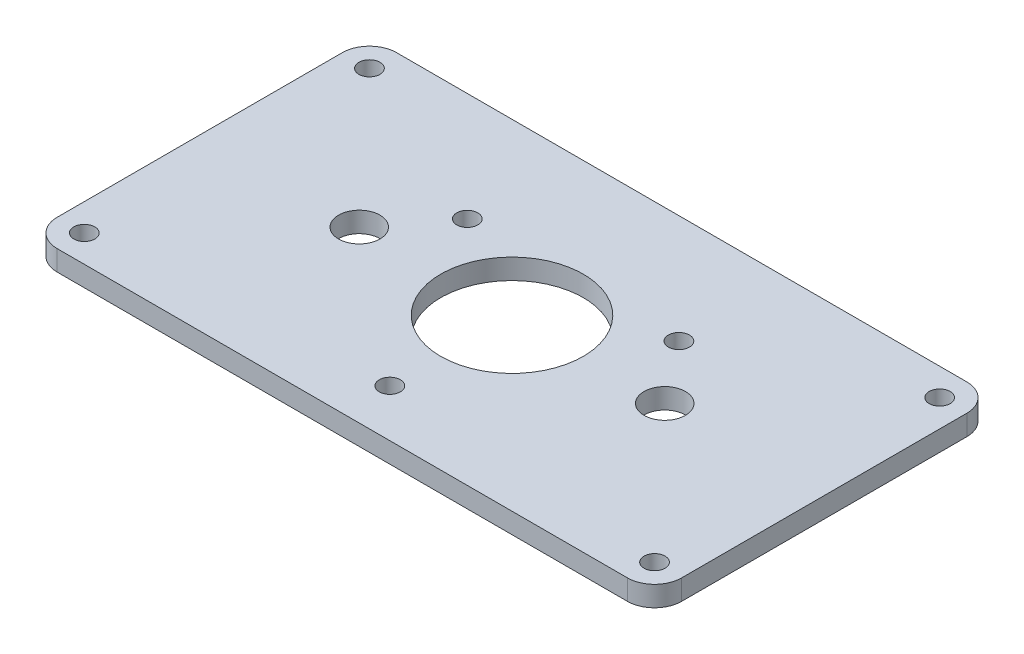
ISO-10303-21;
HEADER;
FILE_DESCRIPTION(('STEP AP214'),'2;1');
FILE_NAME('part.step','',(''),(''),'','','');
FILE_SCHEMA(('AUTOMOTIVE_DESIGN { 1 0 10303 214 1 1 1 1 }'));
ENDSEC;
DATA;
#1=APPLICATION_CONTEXT('core data for automotive mechanical design processes');
#2=APPLICATION_PROTOCOL_DEFINITION('international standard','automotive_design',2000,#1);
#3=PRODUCT_CONTEXT('',#1,'mechanical');
#4=PRODUCT('Part','Part','',(#3));
#5=PRODUCT_RELATED_PRODUCT_CATEGORY('part','',(#4));
#6=PRODUCT_DEFINITION_FORMATION('','',#4);
#7=PRODUCT_DEFINITION_CONTEXT('part definition',#1,'design');
#8=PRODUCT_DEFINITION('design','',#6,#7);
#9=PRODUCT_DEFINITION_SHAPE('','',#8);
#10=(LENGTH_UNIT() NAMED_UNIT(*) SI_UNIT(.MILLI.,.METRE.));
#11=(NAMED_UNIT(*) PLANE_ANGLE_UNIT() SI_UNIT($,.RADIAN.));
#12=(NAMED_UNIT(*) SI_UNIT($,.STERADIAN.) SOLID_ANGLE_UNIT());
#13=UNCERTAINTY_MEASURE_WITH_UNIT(LENGTH_MEASURE(1.E-05),#10,'distance_accuracy_value','');
#14=(GEOMETRIC_REPRESENTATION_CONTEXT(3) GLOBAL_UNCERTAINTY_ASSIGNED_CONTEXT((#13)) GLOBAL_UNIT_ASSIGNED_CONTEXT((#10,
#11,#12)) REPRESENTATION_CONTEXT('',''));
#15=CARTESIAN_POINT('',(0.,0.,0.));
#16=DIRECTION('',(0.,0.,1.));
#17=DIRECTION('',(1.,0.,0.));
#18=AXIS2_PLACEMENT_3D('',#15,#16,#17);
#19=CARTESIAN_POINT('',(0.,3.,0.));
#20=DIRECTION('',(0.,-1.,0.));
#21=DIRECTION('',(0.,0.,-1.));
#22=AXIS2_PLACEMENT_3D('',#19,#20,#21);
#23=PLANE('',#22);
#24=CARTESIAN_POINT('',(-22.5,3.,0.));
#25=DIRECTION('',(0.,-1.,0.));
#26=DIRECTION('',(0.,0.,-1.));
#27=AXIS2_PLACEMENT_3D('',#24,#25,#26);
#28=CIRCLE('',#27,3.05);
#29=CARTESIAN_POINT('',(-22.5,3.,-3.05));
#30=VERTEX_POINT('',#29);
#31=EDGE_CURVE('E222',#30,#30,#28,.T.);
#32=ORIENTED_EDGE('',*,*,#31,.T.);
#33=EDGE_LOOP('',(#32));
#34=FACE_BOUND('',#33,.T.);
#35=CARTESIAN_POINT('',(22.5,3.,0.));
#36=DIRECTION('',(0.,-1.,0.));
#37=DIRECTION('',(0.,0.,-1.));
#38=AXIS2_PLACEMENT_3D('',#35,#36,#37);
#39=CIRCLE('',#38,3.05);
#40=CARTESIAN_POINT('',(22.5,3.,-3.04999999999999));
#41=VERTEX_POINT('',#40);
#42=EDGE_CURVE('E227',#41,#41,#39,.T.);
#43=ORIENTED_EDGE('',*,*,#42,.T.);
#44=EDGE_LOOP('',(#43));
#45=FACE_BOUND('',#44,.T.);
#46=DIRECTION('',(0.,0.,-1.));
#47=VECTOR('',#46,1.);
#48=CARTESIAN_POINT('',(46.,3.,25.));
#49=LINE('',#48,#47);
#50=CARTESIAN_POINT('',(46.,3.,21.));
#51=VERTEX_POINT('',#50);
#52=CARTESIAN_POINT('',(46.,3.,-21.));
#53=VERTEX_POINT('',#52);
#54=EDGE_CURVE('E137',#51,#53,#49,.T.);
#55=ORIENTED_EDGE('',*,*,#54,.T.);
#56=CARTESIAN_POINT('',(42.,3.,-21.));
#57=DIRECTION('',(0.,-1.,0.));
#58=DIRECTION('',(0.,0.,-1.));
#59=AXIS2_PLACEMENT_3D('',#56,#57,#58);
#60=CIRCLE('',#59,4.);
#61=CARTESIAN_POINT('',(42.,3.,-25.));
#62=VERTEX_POINT('',#61);
#63=EDGE_CURVE('E152',#53,#62,#60,.F.);
#64=ORIENTED_EDGE('',*,*,#63,.T.);
#65=DIRECTION('',(-1.,0.,0.));
#66=VECTOR('',#65,1.);
#67=CARTESIAN_POINT('',(-46.,3.,-25.));
#68=LINE('',#67,#66);
#69=CARTESIAN_POINT('',(-42.,3.,-25.));
#70=VERTEX_POINT('',#69);
#71=EDGE_CURVE('E119',#62,#70,#68,.T.);
#72=ORIENTED_EDGE('',*,*,#71,.T.);
#73=CARTESIAN_POINT('',(-42.,3.,-21.));
#74=DIRECTION('',(0.,-1.,0.));
#75=DIRECTION('',(0.,0.,-1.));
#76=AXIS2_PLACEMENT_3D('',#73,#74,#75);
#77=CIRCLE('',#76,4.);
#78=CARTESIAN_POINT('',(-46.,3.,-21.));
#79=VERTEX_POINT('',#78);
#80=EDGE_CURVE('E147',#70,#79,#77,.F.);
#81=ORIENTED_EDGE('',*,*,#80,.T.);
#82=DIRECTION('',(0.,0.,1.));
#83=VECTOR('',#82,1.);
#84=CARTESIAN_POINT('',(-46.,3.,25.));
#85=LINE('',#84,#83);
#86=CARTESIAN_POINT('',(-46.,3.,21.));
#87=VERTEX_POINT('',#86);
#88=EDGE_CURVE('E163',#79,#87,#85,.T.);
#89=ORIENTED_EDGE('',*,*,#88,.T.);
#90=CARTESIAN_POINT('',(-42.,3.,21.));
#91=DIRECTION('',(0.,-1.,0.));
#92=DIRECTION('',(0.,0.,-1.));
#93=AXIS2_PLACEMENT_3D('',#90,#91,#92);
#94=CIRCLE('',#93,4.);
#95=CARTESIAN_POINT('',(-42.,3.,25.));
#96=VERTEX_POINT('',#95);
#97=EDGE_CURVE('E55',#87,#96,#94,.F.);
#98=ORIENTED_EDGE('',*,*,#97,.T.);
#99=DIRECTION('',(1.,0.,0.));
#100=VECTOR('',#99,1.);
#101=CARTESIAN_POINT('',(-46.,3.,25.));
#102=LINE('',#101,#100);
#103=CARTESIAN_POINT('',(42.,3.,25.));
#104=VERTEX_POINT('',#103);
#105=EDGE_CURVE('E138',#96,#104,#102,.T.);
#106=ORIENTED_EDGE('',*,*,#105,.T.);
#107=CARTESIAN_POINT('',(42.,3.,21.));
#108=DIRECTION('',(0.,-1.,0.));
#109=DIRECTION('',(0.,0.,-1.));
#110=AXIS2_PLACEMENT_3D('',#107,#108,#109);
#111=CIRCLE('',#110,4.);
#112=EDGE_CURVE('E150',#104,#51,#111,.F.);
#113=ORIENTED_EDGE('',*,*,#112,.T.);
#114=EDGE_LOOP('',(#55,#64,#72,#81,#89,#98,#106,#113));
#115=FACE_BOUND('',#114,.T.);
#116=CARTESIAN_POINT('',(0.,3.,0.));
#117=DIRECTION('',(0.,1.,0.));
#118=DIRECTION('',(0.,0.,1.));
#119=AXIS2_PLACEMENT_3D('',#116,#117,#118);
#120=CIRCLE('',#119,10.5);
#121=CARTESIAN_POINT('',(0.,3.,10.5));
#122=VERTEX_POINT('',#121);
#123=EDGE_CURVE('E132',#122,#122,#120,.T.);
#124=ORIENTED_EDGE('',*,*,#123,.F.);
#125=EDGE_LOOP('',(#124));
#126=FACE_BOUND('',#125,.T.);
#127=CARTESIAN_POINT('',(42.,3.,-21.));
#128=DIRECTION('',(0.,1.,0.));
#129=DIRECTION('',(0.,0.,1.));
#130=AXIS2_PLACEMENT_3D('',#127,#128,#129);
#131=CIRCLE('',#130,1.55);
#132=CARTESIAN_POINT('',(42.,3.,-19.45));
#133=VERTEX_POINT('',#132);
#134=EDGE_CURVE('E180',#133,#133,#131,.T.);
#135=ORIENTED_EDGE('',*,*,#134,.F.);
#136=EDGE_LOOP('',(#135));
#137=FACE_BOUND('',#136,.T.);
#138=CARTESIAN_POINT('',(-42.,3.,-21.));
#139=DIRECTION('',(0.,1.,0.));
#140=DIRECTION('',(0.,0.,-1.));
#141=AXIS2_PLACEMENT_3D('',#138,#139,#140);
#142=CIRCLE('',#141,1.55);
#143=CARTESIAN_POINT('',(-42.,3.,-22.55));
#144=VERTEX_POINT('',#143);
#145=EDGE_CURVE('E186',#144,#144,#142,.T.);
#146=ORIENTED_EDGE('',*,*,#145,.F.);
#147=EDGE_LOOP('',(#146));
#148=FACE_BOUND('',#147,.T.);
#149=CARTESIAN_POINT('',(42.,3.,21.));
#150=DIRECTION('',(0.,1.,0.));
#151=DIRECTION('',(0.,0.,-1.));
#152=AXIS2_PLACEMENT_3D('',#149,#150,#151);
#153=CIRCLE('',#152,1.55);
#154=CARTESIAN_POINT('',(42.,3.,19.45));
#155=VERTEX_POINT('',#154);
#156=EDGE_CURVE('E192',#155,#155,#153,.T.);
#157=ORIENTED_EDGE('',*,*,#156,.F.);
#158=EDGE_LOOP('',(#157));
#159=FACE_BOUND('',#158,.T.);
#160=CARTESIAN_POINT('',(-42.,3.,21.));
#161=DIRECTION('',(0.,1.,0.));
#162=DIRECTION('',(0.,0.,1.));
#163=AXIS2_PLACEMENT_3D('',#160,#161,#162);
#164=CIRCLE('',#163,1.55);
#165=CARTESIAN_POINT('',(-42.,3.,22.55));
#166=VERTEX_POINT('',#165);
#167=EDGE_CURVE('E198',#166,#166,#164,.T.);
#168=ORIENTED_EDGE('',*,*,#167,.F.);
#169=EDGE_LOOP('',(#168));
#170=FACE_BOUND('',#169,.T.);
#171=CARTESIAN_POINT('',(0.,3.,18.));
#172=DIRECTION('',(0.,1.,0.));
#173=DIRECTION('',(0.,0.,1.));
#174=AXIS2_PLACEMENT_3D('',#171,#172,#173);
#175=CIRCLE('',#174,1.55);
#176=CARTESIAN_POINT('',(0.,3.,19.55));
#177=VERTEX_POINT('',#176);
#178=EDGE_CURVE('E204',#177,#177,#175,.T.);
#179=ORIENTED_EDGE('',*,*,#178,.F.);
#180=EDGE_LOOP('',(#179));
#181=FACE_BOUND('',#180,.T.);
#182=CARTESIAN_POINT('',(-15.5884572681199,3.,-8.99999999999999));
#183=DIRECTION('',(0.,1.,0.));
#184=DIRECTION('',(0.,0.,1.));
#185=AXIS2_PLACEMENT_3D('',#182,#183,#184);
#186=CIRCLE('',#185,1.55);
#187=CARTESIAN_POINT('',(-15.5884572681199,3.,-7.44999999999999));
#188=VERTEX_POINT('',#187);
#189=EDGE_CURVE('E210',#188,#188,#186,.T.);
#190=ORIENTED_EDGE('',*,*,#189,.F.);
#191=EDGE_LOOP('',(#190));
#192=FACE_BOUND('',#191,.T.);
#193=CARTESIAN_POINT('',(15.5884572681199,3.,-9.00000000000001));
#194=DIRECTION('',(0.,1.,0.));
#195=DIRECTION('',(0.,0.,1.));
#196=AXIS2_PLACEMENT_3D('',#193,#194,#195);
#197=CIRCLE('',#196,1.55);
#198=CARTESIAN_POINT('',(15.5884572681199,3.,-7.45000000000002));
#199=VERTEX_POINT('',#198);
#200=EDGE_CURVE('E216',#199,#199,#197,.T.);
#201=ORIENTED_EDGE('',*,*,#200,.F.);
#202=EDGE_LOOP('',(#201));
#203=FACE_BOUND('',#202,.T.);
#204=ADVANCED_FACE('F33',(#34,#45,#115,#126,#137,#148,#159,#170,#181,#192,#203),#23,.F.);
#205=CARTESIAN_POINT('',(0.,0.,0.));
#206=DIRECTION('',(0.,-1.,0.));
#207=DIRECTION('',(0.,0.,-1.));
#208=AXIS2_PLACEMENT_3D('',#205,#206,#207);
#209=PLANE('',#208);
#210=CARTESIAN_POINT('',(-22.5,0.,0.));
#211=DIRECTION('',(0.,-1.,0.));
#212=DIRECTION('',(0.,0.,-1.));
#213=AXIS2_PLACEMENT_3D('',#210,#211,#212);
#214=CIRCLE('',#213,3.05);
#215=CARTESIAN_POINT('',(-22.5,0.,-3.05));
#216=VERTEX_POINT('',#215);
#217=EDGE_CURVE('E230',#216,#216,#214,.T.);
#218=ORIENTED_EDGE('',*,*,#217,.F.);
#219=EDGE_LOOP('',(#218));
#220=FACE_BOUND('',#219,.T.);
#221=CARTESIAN_POINT('',(22.5,0.,0.));
#222=DIRECTION('',(0.,-1.,0.));
#223=DIRECTION('',(0.,0.,-1.));
#224=AXIS2_PLACEMENT_3D('',#221,#222,#223);
#225=CIRCLE('',#224,3.05);
#226=CARTESIAN_POINT('',(22.5,0.,-3.04999999999999));
#227=VERTEX_POINT('',#226);
#228=EDGE_CURVE('E231',#227,#227,#225,.T.);
#229=ORIENTED_EDGE('',*,*,#228,.F.);
#230=EDGE_LOOP('',(#229));
#231=FACE_BOUND('',#230,.T.);
#232=CARTESIAN_POINT('',(-15.5884572681199,0.,-8.99999999999999));
#233=DIRECTION('',(0.,1.,0.));
#234=DIRECTION('',(0.,0.,1.));
#235=AXIS2_PLACEMENT_3D('',#232,#233,#234);
#236=CIRCLE('',#235,1.55);
#237=CARTESIAN_POINT('',(-15.5884572681199,0.,-7.44999999999999));
#238=VERTEX_POINT('',#237);
#239=EDGE_CURVE('E213',#238,#238,#236,.T.);
#240=ORIENTED_EDGE('',*,*,#239,.T.);
#241=EDGE_LOOP('',(#240));
#242=FACE_BOUND('',#241,.T.);
#243=CARTESIAN_POINT('',(-42.,0.,21.));
#244=DIRECTION('',(0.,1.,0.));
#245=DIRECTION('',(0.,0.,1.));
#246=AXIS2_PLACEMENT_3D('',#243,#244,#245);
#247=CIRCLE('',#246,1.55);
#248=CARTESIAN_POINT('',(-42.,0.,22.55));
#249=VERTEX_POINT('',#248);
#250=EDGE_CURVE('E201',#249,#249,#247,.T.);
#251=ORIENTED_EDGE('',*,*,#250,.T.);
#252=EDGE_LOOP('',(#251));
#253=FACE_BOUND('',#252,.T.);
#254=CARTESIAN_POINT('',(-42.,0.,-21.));
#255=DIRECTION('',(0.,1.,0.));
#256=DIRECTION('',(0.,0.,-1.));
#257=AXIS2_PLACEMENT_3D('',#254,#255,#256);
#258=CIRCLE('',#257,1.55);
#259=CARTESIAN_POINT('',(-42.,0.,-22.55));
#260=VERTEX_POINT('',#259);
#261=EDGE_CURVE('E189',#260,#260,#258,.T.);
#262=ORIENTED_EDGE('',*,*,#261,.T.);
#263=EDGE_LOOP('',(#262));
#264=FACE_BOUND('',#263,.T.);
#265=CARTESIAN_POINT('',(0.,0.,0.));
#266=DIRECTION('',(0.,1.,0.));
#267=DIRECTION('',(0.,0.,1.));
#268=AXIS2_PLACEMENT_3D('',#265,#266,#267);
#269=CIRCLE('',#268,10.5);
#270=CARTESIAN_POINT('',(0.,0.,10.5));
#271=VERTEX_POINT('',#270);
#272=EDGE_CURVE('E177',#271,#271,#269,.T.);
#273=ORIENTED_EDGE('',*,*,#272,.T.);
#274=EDGE_LOOP('',(#273));
#275=FACE_BOUND('',#274,.T.);
#276=DIRECTION('',(-1.,0.,0.));
#277=VECTOR('',#276,1.);
#278=CARTESIAN_POINT('',(-46.,0.,-25.));
#279=LINE('',#278,#277);
#280=CARTESIAN_POINT('',(42.,0.,-25.));
#281=VERTEX_POINT('',#280);
#282=CARTESIAN_POINT('',(-42.,0.,-25.));
#283=VERTEX_POINT('',#282);
#284=EDGE_CURVE('E116',#281,#283,#279,.T.);
#285=ORIENTED_EDGE('',*,*,#284,.F.);
#286=CARTESIAN_POINT('',(42.,0.,-21.));
#287=DIRECTION('',(0.,-1.,0.));
#288=DIRECTION('',(0.,0.,-1.));
#289=AXIS2_PLACEMENT_3D('',#286,#287,#288);
#290=CIRCLE('',#289,4.);
#291=CARTESIAN_POINT('',(46.,0.,-21.));
#292=VERTEX_POINT('',#291);
#293=EDGE_CURVE('E99',#281,#292,#290,.T.);
#294=ORIENTED_EDGE('',*,*,#293,.T.);
#295=DIRECTION('',(0.,0.,-1.));
#296=VECTOR('',#295,1.);
#297=CARTESIAN_POINT('',(46.,0.,25.));
#298=LINE('',#297,#296);
#299=CARTESIAN_POINT('',(46.,0.,21.));
#300=VERTEX_POINT('',#299);
#301=EDGE_CURVE('E127',#300,#292,#298,.T.);
#302=ORIENTED_EDGE('',*,*,#301,.F.);
#303=CARTESIAN_POINT('',(42.,0.,21.));
#304=DIRECTION('',(0.,-1.,0.));
#305=DIRECTION('',(0.,0.,-1.));
#306=AXIS2_PLACEMENT_3D('',#303,#304,#305);
#307=CIRCLE('',#306,4.);
#308=CARTESIAN_POINT('',(42.,0.,25.));
#309=VERTEX_POINT('',#308);
#310=EDGE_CURVE('E110',#300,#309,#307,.T.);
#311=ORIENTED_EDGE('',*,*,#310,.T.);
#312=DIRECTION('',(1.,0.,0.));
#313=VECTOR('',#312,1.);
#314=CARTESIAN_POINT('',(-46.,0.,25.));
#315=LINE('',#314,#313);
#316=CARTESIAN_POINT('',(-42.,0.,25.));
#317=VERTEX_POINT('',#316);
#318=EDGE_CURVE('E130',#317,#309,#315,.T.);
#319=ORIENTED_EDGE('',*,*,#318,.F.);
#320=CARTESIAN_POINT('',(-42.,0.,21.));
#321=DIRECTION('',(0.,-1.,0.));
#322=DIRECTION('',(0.,0.,-1.));
#323=AXIS2_PLACEMENT_3D('',#320,#321,#322);
#324=CIRCLE('',#323,4.);
#325=CARTESIAN_POINT('',(-46.,0.,21.));
#326=VERTEX_POINT('',#325);
#327=EDGE_CURVE('E141',#317,#326,#324,.T.);
#328=ORIENTED_EDGE('',*,*,#327,.T.);
#329=DIRECTION('',(0.,0.,1.));
#330=VECTOR('',#329,1.);
#331=CARTESIAN_POINT('',(-46.,0.,25.));
#332=LINE('',#331,#330);
#333=CARTESIAN_POINT('',(-46.,0.,-21.));
#334=VERTEX_POINT('',#333);
#335=EDGE_CURVE('E126',#334,#326,#332,.T.);
#336=ORIENTED_EDGE('',*,*,#335,.F.);
#337=CARTESIAN_POINT('',(-42.,0.,-21.));
#338=DIRECTION('',(0.,-1.,0.));
#339=DIRECTION('',(0.,0.,-1.));
#340=AXIS2_PLACEMENT_3D('',#337,#338,#339);
#341=CIRCLE('',#340,4.);
#342=EDGE_CURVE('E120',#334,#283,#341,.T.);
#343=ORIENTED_EDGE('',*,*,#342,.T.);
#344=EDGE_LOOP('',(#285,#294,#302,#311,#319,#328,#336,#343));
#345=FACE_BOUND('',#344,.T.);
#346=CARTESIAN_POINT('',(42.,0.,-21.));
#347=DIRECTION('',(0.,1.,0.));
#348=DIRECTION('',(0.,0.,1.));
#349=AXIS2_PLACEMENT_3D('',#346,#347,#348);
#350=CIRCLE('',#349,1.55);
#351=CARTESIAN_POINT('',(42.,0.,-19.45));
#352=VERTEX_POINT('',#351);
#353=EDGE_CURVE('E183',#352,#352,#350,.T.);
#354=ORIENTED_EDGE('',*,*,#353,.T.);
#355=EDGE_LOOP('',(#354));
#356=FACE_BOUND('',#355,.T.);
#357=CARTESIAN_POINT('',(42.,0.,21.));
#358=DIRECTION('',(0.,1.,0.));
#359=DIRECTION('',(0.,0.,-1.));
#360=AXIS2_PLACEMENT_3D('',#357,#358,#359);
#361=CIRCLE('',#360,1.55);
#362=CARTESIAN_POINT('',(42.,0.,19.45));
#363=VERTEX_POINT('',#362);
#364=EDGE_CURVE('E195',#363,#363,#361,.T.);
#365=ORIENTED_EDGE('',*,*,#364,.T.);
#366=EDGE_LOOP('',(#365));
#367=FACE_BOUND('',#366,.T.);
#368=CARTESIAN_POINT('',(0.,0.,18.));
#369=DIRECTION('',(0.,1.,0.));
#370=DIRECTION('',(0.,0.,1.));
#371=AXIS2_PLACEMENT_3D('',#368,#369,#370);
#372=CIRCLE('',#371,1.55);
#373=CARTESIAN_POINT('',(0.,0.,19.55));
#374=VERTEX_POINT('',#373);
#375=EDGE_CURVE('E207',#374,#374,#372,.T.);
#376=ORIENTED_EDGE('',*,*,#375,.T.);
#377=EDGE_LOOP('',(#376));
#378=FACE_BOUND('',#377,.T.);
#379=CARTESIAN_POINT('',(15.5884572681199,0.,-9.00000000000001));
#380=DIRECTION('',(0.,1.,0.));
#381=DIRECTION('',(0.,0.,1.));
#382=AXIS2_PLACEMENT_3D('',#379,#380,#381);
#383=CIRCLE('',#382,1.55);
#384=CARTESIAN_POINT('',(15.5884572681199,0.,-7.45000000000002));
#385=VERTEX_POINT('',#384);
#386=EDGE_CURVE('E219',#385,#385,#383,.T.);
#387=ORIENTED_EDGE('',*,*,#386,.T.);
#388=EDGE_LOOP('',(#387));
#389=FACE_BOUND('',#388,.T.);
#390=ADVANCED_FACE('F123',(#220,#231,#242,#253,#264,#275,#345,#356,#367,#378,#389),#209,.T.);
#391=CARTESIAN_POINT('',(46.,3.,25.));
#392=DIRECTION('',(-1.,0.,0.));
#393=DIRECTION('',(0.,0.,1.));
#394=AXIS2_PLACEMENT_3D('',#391,#392,#393);
#395=PLANE('',#394);
#396=ORIENTED_EDGE('',*,*,#301,.T.);
#397=DIRECTION('',(0.,-1.,0.));
#398=VECTOR('',#397,1.);
#399=CARTESIAN_POINT('',(46.,3.,-21.));
#400=LINE('',#399,#398);
#401=EDGE_CURVE('E104',#292,#53,#400,.F.);
#402=ORIENTED_EDGE('',*,*,#401,.T.);
#403=ORIENTED_EDGE('',*,*,#54,.F.);
#404=DIRECTION('',(0.,-1.,0.));
#405=VECTOR('',#404,1.);
#406=CARTESIAN_POINT('',(46.,3.,21.));
#407=LINE('',#406,#405);
#408=EDGE_CURVE('E109',#51,#300,#407,.T.);
#409=ORIENTED_EDGE('',*,*,#408,.T.);
#410=EDGE_LOOP('',(#396,#402,#403,#409));
#411=FACE_BOUND('',#410,.T.);
#412=ADVANCED_FACE('F242',(#411),#395,.F.);
#413=CARTESIAN_POINT('',(-46.,3.,-25.));
#414=DIRECTION('',(0.,0.,1.));
#415=DIRECTION('',(1.,0.,0.));
#416=AXIS2_PLACEMENT_3D('',#413,#414,#415);
#417=PLANE('',#416);
#418=ORIENTED_EDGE('',*,*,#71,.F.);
#419=DIRECTION('',(0.,-1.,0.));
#420=VECTOR('',#419,1.);
#421=CARTESIAN_POINT('',(42.,3.,-25.));
#422=LINE('',#421,#420);
#423=EDGE_CURVE('E103',#62,#281,#422,.T.);
#424=ORIENTED_EDGE('',*,*,#423,.T.);
#425=ORIENTED_EDGE('',*,*,#284,.T.);
#426=DIRECTION('',(0.,-1.,0.));
#427=VECTOR('',#426,1.);
#428=CARTESIAN_POINT('',(-42.,3.,-25.));
#429=LINE('',#428,#427);
#430=EDGE_CURVE('E121',#283,#70,#429,.F.);
#431=ORIENTED_EDGE('',*,*,#430,.T.);
#432=EDGE_LOOP('',(#418,#424,#425,#431));
#433=FACE_BOUND('',#432,.T.);
#434=ADVANCED_FACE('F115',(#433),#417,.F.);
#435=CARTESIAN_POINT('',(-46.,3.,25.));
#436=DIRECTION('',(1.,0.,0.));
#437=DIRECTION('',(0.,0.,-1.));
#438=AXIS2_PLACEMENT_3D('',#435,#436,#437);
#439=PLANE('',#438);
#440=ORIENTED_EDGE('',*,*,#335,.T.);
#441=DIRECTION('',(0.,-1.,0.));
#442=VECTOR('',#441,1.);
#443=CARTESIAN_POINT('',(-46.,3.,21.));
#444=LINE('',#443,#442);
#445=EDGE_CURVE('E11',#326,#87,#444,.F.);
#446=ORIENTED_EDGE('',*,*,#445,.T.);
#447=ORIENTED_EDGE('',*,*,#88,.F.);
#448=DIRECTION('',(0.,-1.,0.));
#449=VECTOR('',#448,1.);
#450=CARTESIAN_POINT('',(-46.,3.,-21.));
#451=LINE('',#450,#449);
#452=EDGE_CURVE('E41',#79,#334,#451,.T.);
#453=ORIENTED_EDGE('',*,*,#452,.T.);
#454=EDGE_LOOP('',(#440,#446,#447,#453));
#455=FACE_BOUND('',#454,.T.);
#456=ADVANCED_FACE('F161',(#455),#439,.F.);
#457=CARTESIAN_POINT('',(-46.,3.,25.));
#458=DIRECTION('',(0.,0.,-1.));
#459=DIRECTION('',(-1.,0.,0.));
#460=AXIS2_PLACEMENT_3D('',#457,#458,#459);
#461=PLANE('',#460);
#462=ORIENTED_EDGE('',*,*,#318,.T.);
#463=DIRECTION('',(0.,-1.,0.));
#464=VECTOR('',#463,1.);
#465=CARTESIAN_POINT('',(42.,3.,25.));
#466=LINE('',#465,#464);
#467=EDGE_CURVE('E48',#309,#104,#466,.F.);
#468=ORIENTED_EDGE('',*,*,#467,.T.);
#469=ORIENTED_EDGE('',*,*,#105,.F.);
#470=DIRECTION('',(0.,-1.,0.));
#471=VECTOR('',#470,1.);
#472=CARTESIAN_POINT('',(-42.,3.,25.));
#473=LINE('',#472,#471);
#474=EDGE_CURVE('E154',#96,#317,#473,.T.);
#475=ORIENTED_EDGE('',*,*,#474,.T.);
#476=EDGE_LOOP('',(#462,#468,#469,#475));
#477=FACE_BOUND('',#476,.T.);
#478=ADVANCED_FACE('F170',(#477),#461,.F.);
#479=CARTESIAN_POINT('',(0.,3.,0.));
#480=DIRECTION('',(0.,-1.,0.));
#481=DIRECTION('',(0.,0.,-1.));
#482=AXIS2_PLACEMENT_3D('',#479,#480,#481);
#483=CYLINDRICAL_SURFACE('',#482,10.5);
#484=ORIENTED_EDGE('',*,*,#123,.T.);
#485=EDGE_LOOP('',(#484));
#486=FACE_BOUND('',#485,.T.);
#487=ORIENTED_EDGE('',*,*,#272,.F.);
#488=EDGE_LOOP('',(#487));
#489=FACE_BOUND('',#488,.T.);
#490=ADVANCED_FACE('F254',(#486,#489),#483,.F.);
#491=CARTESIAN_POINT('',(42.,3.,-21.));
#492=DIRECTION('',(0.,-1.,0.));
#493=DIRECTION('',(0.,0.,-1.));
#494=AXIS2_PLACEMENT_3D('',#491,#492,#493);
#495=CYLINDRICAL_SURFACE('',#494,1.55);
#496=ORIENTED_EDGE('',*,*,#134,.T.);
#497=EDGE_LOOP('',(#496));
#498=FACE_BOUND('',#497,.T.);
#499=ORIENTED_EDGE('',*,*,#353,.F.);
#500=EDGE_LOOP('',(#499));
#501=FACE_BOUND('',#500,.T.);
#502=ADVANCED_FACE('F256',(#498,#501),#495,.F.);
#503=CARTESIAN_POINT('',(-42.,3.,-21.));
#504=DIRECTION('',(0.,-1.,0.));
#505=DIRECTION('',(0.,0.,-1.));
#506=AXIS2_PLACEMENT_3D('',#503,#504,#505);
#507=CYLINDRICAL_SURFACE('',#506,1.55);
#508=ORIENTED_EDGE('',*,*,#145,.T.);
#509=EDGE_LOOP('',(#508));
#510=FACE_BOUND('',#509,.T.);
#511=ORIENTED_EDGE('',*,*,#261,.F.);
#512=EDGE_LOOP('',(#511));
#513=FACE_BOUND('',#512,.T.);
#514=ADVANCED_FACE('F263',(#510,#513),#507,.F.);
#515=CARTESIAN_POINT('',(42.,3.,21.));
#516=DIRECTION('',(0.,-1.,0.));
#517=DIRECTION('',(0.,0.,-1.));
#518=AXIS2_PLACEMENT_3D('',#515,#516,#517);
#519=CYLINDRICAL_SURFACE('',#518,1.55);
#520=ORIENTED_EDGE('',*,*,#156,.T.);
#521=EDGE_LOOP('',(#520));
#522=FACE_BOUND('',#521,.T.);
#523=ORIENTED_EDGE('',*,*,#364,.F.);
#524=EDGE_LOOP('',(#523));
#525=FACE_BOUND('',#524,.T.);
#526=ADVANCED_FACE('F336',(#522,#525),#519,.F.);
#527=CARTESIAN_POINT('',(-42.,3.,21.));
#528=DIRECTION('',(0.,-1.,0.));
#529=DIRECTION('',(0.,0.,-1.));
#530=AXIS2_PLACEMENT_3D('',#527,#528,#529);
#531=CYLINDRICAL_SURFACE('',#530,1.55);
#532=ORIENTED_EDGE('',*,*,#167,.T.);
#533=EDGE_LOOP('',(#532));
#534=FACE_BOUND('',#533,.T.);
#535=ORIENTED_EDGE('',*,*,#250,.F.);
#536=EDGE_LOOP('',(#535));
#537=FACE_BOUND('',#536,.T.);
#538=ADVANCED_FACE('F332',(#534,#537),#531,.F.);
#539=CARTESIAN_POINT('',(0.,3.,18.));
#540=DIRECTION('',(0.,-1.,0.));
#541=DIRECTION('',(0.,0.,-1.));
#542=AXIS2_PLACEMENT_3D('',#539,#540,#541);
#543=CYLINDRICAL_SURFACE('',#542,1.55);
#544=ORIENTED_EDGE('',*,*,#178,.T.);
#545=EDGE_LOOP('',(#544));
#546=FACE_BOUND('',#545,.T.);
#547=ORIENTED_EDGE('',*,*,#375,.F.);
#548=EDGE_LOOP('',(#547));
#549=FACE_BOUND('',#548,.T.);
#550=ADVANCED_FACE('F325',(#546,#549),#543,.F.);
#551=CARTESIAN_POINT('',(-15.5884572681199,3.,-8.99999999999999));
#552=DIRECTION('',(0.,-1.,0.));
#553=DIRECTION('',(0.,0.,-1.));
#554=AXIS2_PLACEMENT_3D('',#551,#552,#553);
#555=CYLINDRICAL_SURFACE('',#554,1.55);
#556=ORIENTED_EDGE('',*,*,#189,.T.);
#557=EDGE_LOOP('',(#556));
#558=FACE_BOUND('',#557,.T.);
#559=ORIENTED_EDGE('',*,*,#239,.F.);
#560=EDGE_LOOP('',(#559));
#561=FACE_BOUND('',#560,.T.);
#562=ADVANCED_FACE('F318',(#558,#561),#555,.F.);
#563=CARTESIAN_POINT('',(15.5884572681199,3.,-9.00000000000001));
#564=DIRECTION('',(0.,-1.,0.));
#565=DIRECTION('',(0.,0.,-1.));
#566=AXIS2_PLACEMENT_3D('',#563,#564,#565);
#567=CYLINDRICAL_SURFACE('',#566,1.55);
#568=ORIENTED_EDGE('',*,*,#200,.T.);
#569=EDGE_LOOP('',(#568));
#570=FACE_BOUND('',#569,.T.);
#571=ORIENTED_EDGE('',*,*,#386,.F.);
#572=EDGE_LOOP('',(#571));
#573=FACE_BOUND('',#572,.T.);
#574=ADVANCED_FACE('F285',(#570,#573),#567,.F.);
#575=CARTESIAN_POINT('',(42.,3.,-21.));
#576=DIRECTION('',(0.,-1.,0.));
#577=DIRECTION('',(0.,0.,-1.));
#578=AXIS2_PLACEMENT_3D('',#575,#576,#577);
#579=CYLINDRICAL_SURFACE('',#578,4.);
#580=ORIENTED_EDGE('',*,*,#63,.F.);
#581=ORIENTED_EDGE('',*,*,#401,.F.);
#582=ORIENTED_EDGE('',*,*,#293,.F.);
#583=ORIENTED_EDGE('',*,*,#423,.F.);
#584=EDGE_LOOP('',(#580,#581,#582,#583));
#585=FACE_BOUND('',#584,.T.);
#586=ADVANCED_FACE('F102',(#585),#579,.T.);
#587=CARTESIAN_POINT('',(42.,3.,21.));
#588=DIRECTION('',(0.,-1.,0.));
#589=DIRECTION('',(0.,0.,-1.));
#590=AXIS2_PLACEMENT_3D('',#587,#588,#589);
#591=CYLINDRICAL_SURFACE('',#590,4.);
#592=ORIENTED_EDGE('',*,*,#112,.F.);
#593=ORIENTED_EDGE('',*,*,#467,.F.);
#594=ORIENTED_EDGE('',*,*,#310,.F.);
#595=ORIENTED_EDGE('',*,*,#408,.F.);
#596=EDGE_LOOP('',(#592,#593,#594,#595));
#597=FACE_BOUND('',#596,.T.);
#598=ADVANCED_FACE('F284',(#597),#591,.T.);
#599=CARTESIAN_POINT('',(-42.,3.,21.));
#600=DIRECTION('',(0.,-1.,0.));
#601=DIRECTION('',(0.,0.,-1.));
#602=AXIS2_PLACEMENT_3D('',#599,#600,#601);
#603=CYLINDRICAL_SURFACE('',#602,4.);
#604=ORIENTED_EDGE('',*,*,#97,.F.);
#605=ORIENTED_EDGE('',*,*,#445,.F.);
#606=ORIENTED_EDGE('',*,*,#327,.F.);
#607=ORIENTED_EDGE('',*,*,#474,.F.);
#608=EDGE_LOOP('',(#604,#605,#606,#607));
#609=FACE_BOUND('',#608,.T.);
#610=ADVANCED_FACE('F169',(#609),#603,.T.);
#611=CARTESIAN_POINT('',(-42.,3.,-21.));
#612=DIRECTION('',(0.,-1.,0.));
#613=DIRECTION('',(0.,0.,-1.));
#614=AXIS2_PLACEMENT_3D('',#611,#612,#613);
#615=CYLINDRICAL_SURFACE('',#614,4.);
#616=ORIENTED_EDGE('',*,*,#80,.F.);
#617=ORIENTED_EDGE('',*,*,#430,.F.);
#618=ORIENTED_EDGE('',*,*,#342,.F.);
#619=ORIENTED_EDGE('',*,*,#452,.F.);
#620=EDGE_LOOP('',(#616,#617,#618,#619));
#621=FACE_BOUND('',#620,.T.);
#622=ADVANCED_FACE('F35',(#621),#615,.T.);
#623=CARTESIAN_POINT('',(22.5,10.,0.));
#624=DIRECTION('',(0.,-1.,0.));
#625=DIRECTION('',(0.,0.,-1.));
#626=AXIS2_PLACEMENT_3D('',#623,#624,#625);
#627=CYLINDRICAL_SURFACE('',#626,3.05);
#628=ORIENTED_EDGE('',*,*,#228,.T.);
#629=EDGE_LOOP('',(#628));
#630=FACE_BOUND('',#629,.T.);
#631=ORIENTED_EDGE('',*,*,#42,.F.);
#632=EDGE_LOOP('',(#631));
#633=FACE_BOUND('',#632,.T.);
#634=ADVANCED_FACE('F292',(#630,#633),#627,.F.);
#635=CARTESIAN_POINT('',(-22.5,10.,0.));
#636=DIRECTION('',(0.,-1.,0.));
#637=DIRECTION('',(0.,0.,-1.));
#638=AXIS2_PLACEMENT_3D('',#635,#636,#637);
#639=CYLINDRICAL_SURFACE('',#638,3.05);
#640=ORIENTED_EDGE('',*,*,#217,.T.);
#641=EDGE_LOOP('',(#640));
#642=FACE_BOUND('',#641,.T.);
#643=ORIENTED_EDGE('',*,*,#31,.F.);
#644=EDGE_LOOP('',(#643));
#645=FACE_BOUND('',#644,.T.);
#646=ADVANCED_FACE('F237',(#642,#645),#639,.F.);
#647=CLOSED_SHELL('',(#204,#390,#412,#434,#456,#478,#490,#502,#514,#526,#538,#550,#562,#574,
#586,#598,#610,#622,#634,#646));
#648=MANIFOLD_SOLID_BREP('B2',#647);
#649=ADVANCED_BREP_SHAPE_REPRESENTATION('',(#18,#648),#14);
#650=SHAPE_DEFINITION_REPRESENTATION(#9,#649);
ENDSEC;
END-ISO-10303-21;
